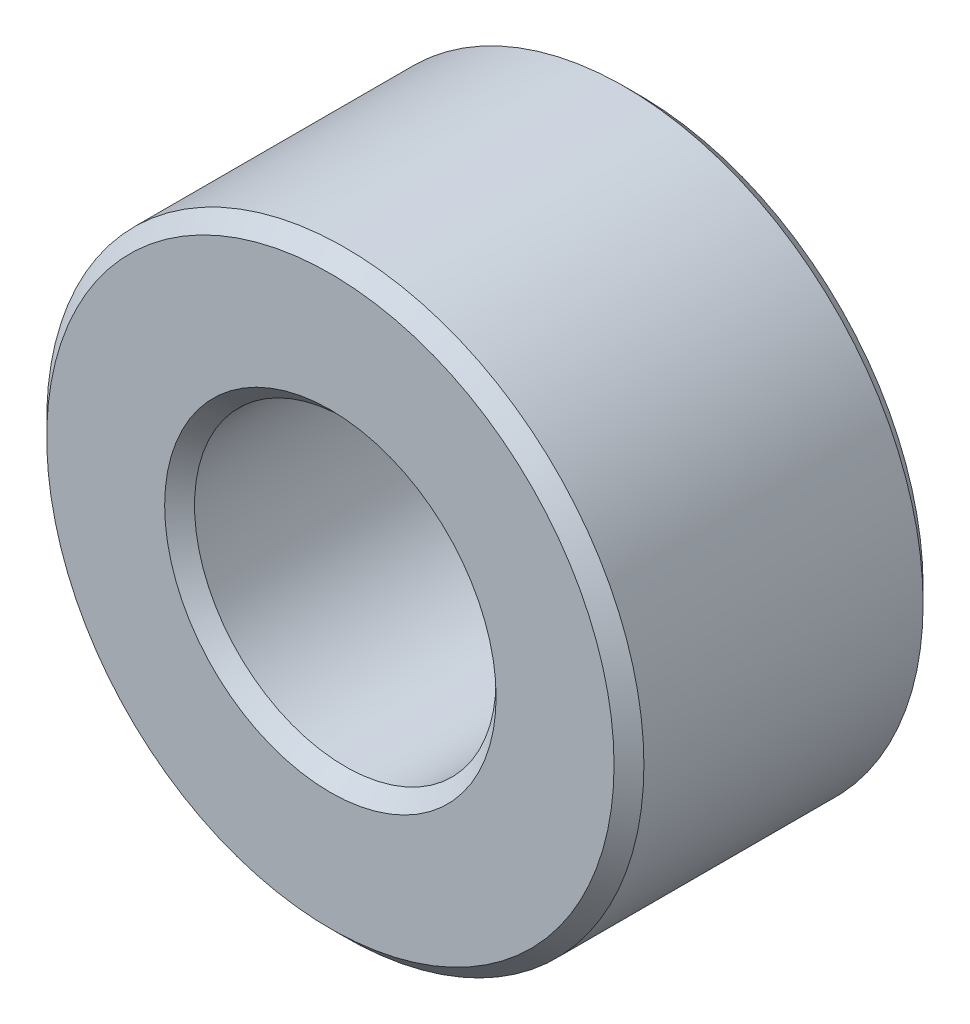
ISO-10303-21;
HEADER;
FILE_DESCRIPTION(('STEP AP214'),'2;1');
FILE_NAME('part.step','',(''),(''),'','','');
FILE_SCHEMA(('AUTOMOTIVE_DESIGN { 1 0 10303 214 1 1 1 1 }'));
ENDSEC;
DATA;
#1=APPLICATION_CONTEXT('core data for automotive mechanical design processes');
#2=APPLICATION_PROTOCOL_DEFINITION('international standard','automotive_design',2000,#1);
#3=PRODUCT_CONTEXT('',#1,'mechanical');
#4=PRODUCT('Part','Part','',(#3));
#5=PRODUCT_RELATED_PRODUCT_CATEGORY('part','',(#4));
#6=PRODUCT_DEFINITION_FORMATION('','',#4);
#7=PRODUCT_DEFINITION_CONTEXT('part definition',#1,'design');
#8=PRODUCT_DEFINITION('design','',#6,#7);
#9=PRODUCT_DEFINITION_SHAPE('','',#8);
#10=(LENGTH_UNIT() NAMED_UNIT(*) SI_UNIT(.MILLI.,.METRE.));
#11=(NAMED_UNIT(*) PLANE_ANGLE_UNIT() SI_UNIT($,.RADIAN.));
#12=(NAMED_UNIT(*) SI_UNIT($,.STERADIAN.) SOLID_ANGLE_UNIT());
#13=UNCERTAINTY_MEASURE_WITH_UNIT(LENGTH_MEASURE(1.E-05),#10,'distance_accuracy_value','');
#14=(GEOMETRIC_REPRESENTATION_CONTEXT(3) GLOBAL_UNCERTAINTY_ASSIGNED_CONTEXT((#13)) GLOBAL_UNIT_ASSIGNED_CONTEXT((#10,
#11,#12)) REPRESENTATION_CONTEXT('',''));
#15=CARTESIAN_POINT('',(0.,0.,0.));
#16=DIRECTION('',(0.,0.,1.));
#17=DIRECTION('',(1.,0.,0.));
#18=AXIS2_PLACEMENT_3D('',#15,#16,#17);
#19=CARTESIAN_POINT('',(0.,0.,5.175));
#20=DIRECTION('',(0.,0.,1.));
#21=DIRECTION('',(1.,0.,0.));
#22=AXIS2_PLACEMENT_3D('',#19,#20,#21);
#23=PLANE('',#22);
#24=CARTESIAN_POINT('',(0.,0.,5.175));
#25=DIRECTION('',(0.,0.,1.));
#26=DIRECTION('',(1.,0.,0.));
#27=AXIS2_PLACEMENT_3D('',#24,#25,#26);
#28=CIRCLE('',#27,5.55000000000001);
#29=CARTESIAN_POINT('',(5.55000000000001,0.,5.175));
#30=VERTEX_POINT('',#29);
#31=EDGE_CURVE('E10',#30,#30,#28,.F.);
#32=ORIENTED_EDGE('',*,*,#31,.T.);
#33=EDGE_LOOP('',(#32));
#34=FACE_BOUND('',#33,.T.);
#35=CARTESIAN_POINT('',(0.,0.,5.175));
#36=DIRECTION('',(0.,0.,1.));
#37=DIRECTION('',(1.,0.,0.));
#38=AXIS2_PLACEMENT_3D('',#35,#36,#37);
#39=CIRCLE('',#38,9.5);
#40=CARTESIAN_POINT('',(9.5,0.,5.175));
#41=VERTEX_POINT('',#40);
#42=EDGE_CURVE('E51',#41,#41,#39,.T.);
#43=ORIENTED_EDGE('',*,*,#42,.T.);
#44=EDGE_LOOP('',(#43));
#45=FACE_BOUND('',#44,.T.);
#46=ADVANCED_FACE('F43',(#34,#45),#23,.T.);
#47=CARTESIAN_POINT('',(0.,0.,-5.175));
#48=DIRECTION('',(0.,0.,1.));
#49=DIRECTION('',(1.,0.,0.));
#50=AXIS2_PLACEMENT_3D('',#47,#48,#49);
#51=PLANE('',#50);
#52=CARTESIAN_POINT('',(0.,0.,-5.175));
#53=DIRECTION('',(0.,0.,1.));
#54=DIRECTION('',(1.,0.,0.));
#55=AXIS2_PLACEMENT_3D('',#52,#53,#54);
#56=CIRCLE('',#55,5.55);
#57=CARTESIAN_POINT('',(5.55,0.,-5.175));
#58=VERTEX_POINT('',#57);
#59=EDGE_CURVE('E66',#58,#58,#56,.T.);
#60=ORIENTED_EDGE('',*,*,#59,.T.);
#61=EDGE_LOOP('',(#60));
#62=FACE_BOUND('',#61,.T.);
#63=CARTESIAN_POINT('',(0.,0.,-5.175));
#64=DIRECTION('',(0.,0.,1.));
#65=DIRECTION('',(1.,0.,0.));
#66=AXIS2_PLACEMENT_3D('',#63,#64,#65);
#67=CIRCLE('',#66,9.5);
#68=CARTESIAN_POINT('',(9.5,0.,-5.175));
#69=VERTEX_POINT('',#68);
#70=EDGE_CURVE('E71',#69,#69,#67,.F.);
#71=ORIENTED_EDGE('',*,*,#70,.T.);
#72=EDGE_LOOP('',(#71));
#73=FACE_BOUND('',#72,.T.);
#74=ADVANCED_FACE('F80',(#62,#73),#51,.F.);
#75=CARTESIAN_POINT('',(0.,0.,5.175));
#76=DIRECTION('',(0.,0.,-1.));
#77=DIRECTION('',(-1.,0.,0.));
#78=AXIS2_PLACEMENT_3D('',#75,#76,#77);
#79=CYLINDRICAL_SURFACE('',#78,10.);
#80=CARTESIAN_POINT('',(0.,0.,-4.675));
#81=DIRECTION('',(0.,0.,1.));
#82=DIRECTION('',(1.,0.,0.));
#83=AXIS2_PLACEMENT_3D('',#80,#81,#82);
#84=CIRCLE('',#83,10.);
#85=CARTESIAN_POINT('',(10.,0.,-4.675));
#86=VERTEX_POINT('',#85);
#87=EDGE_CURVE('E54',#86,#86,#84,.T.);
#88=ORIENTED_EDGE('',*,*,#87,.T.);
#89=EDGE_LOOP('',(#88));
#90=FACE_BOUND('',#89,.T.);
#91=CARTESIAN_POINT('',(0.,0.,4.67499999999999));
#92=DIRECTION('',(0.,0.,1.));
#93=DIRECTION('',(1.,0.,0.));
#94=AXIS2_PLACEMENT_3D('',#91,#92,#93);
#95=CIRCLE('',#94,10.);
#96=CARTESIAN_POINT('',(10.,0.,4.67499999999999));
#97=VERTEX_POINT('',#96);
#98=EDGE_CURVE('E56',#97,#97,#95,.F.);
#99=ORIENTED_EDGE('',*,*,#98,.T.);
#100=EDGE_LOOP('',(#99));
#101=FACE_BOUND('',#100,.T.);
#102=ADVANCED_FACE('F87',(#90,#101),#79,.T.);
#103=CARTESIAN_POINT('',(0.,0.,5.175));
#104=DIRECTION('',(0.,0.,-1.));
#105=DIRECTION('',(-1.,0.,0.));
#106=AXIS2_PLACEMENT_3D('',#103,#104,#105);
#107=CYLINDRICAL_SURFACE('',#106,5.05);
#108=CARTESIAN_POINT('',(0.,0.,-4.675));
#109=DIRECTION('',(0.,0.,1.));
#110=DIRECTION('',(1.,0.,0.));
#111=AXIS2_PLACEMENT_3D('',#108,#109,#110);
#112=CIRCLE('',#111,5.05);
#113=CARTESIAN_POINT('',(5.05,0.,-4.675));
#114=VERTEX_POINT('',#113);
#115=EDGE_CURVE('E62',#114,#114,#112,.F.);
#116=ORIENTED_EDGE('',*,*,#115,.T.);
#117=EDGE_LOOP('',(#116));
#118=FACE_BOUND('',#117,.T.);
#119=CARTESIAN_POINT('',(0.,0.,4.67499999999999));
#120=DIRECTION('',(0.,0.,1.));
#121=DIRECTION('',(1.,0.,0.));
#122=AXIS2_PLACEMENT_3D('',#119,#120,#121);
#123=CIRCLE('',#122,5.05);
#124=CARTESIAN_POINT('',(5.05,0.,4.67499999999999));
#125=VERTEX_POINT('',#124);
#126=EDGE_CURVE('E69',#125,#125,#123,.T.);
#127=ORIENTED_EDGE('',*,*,#126,.T.);
#128=EDGE_LOOP('',(#127));
#129=FACE_BOUND('',#128,.T.);
#130=ADVANCED_FACE('F89',(#118,#129),#107,.F.);
#131=CARTESIAN_POINT('',(0.,0.,-5.175));
#132=DIRECTION('',(0.,0.,-1.));
#133=DIRECTION('',(-1.,0.,0.));
#134=AXIS2_PLACEMENT_3D('',#131,#132,#133);
#135=CONICAL_SURFACE('',#134,5.55,0.785398163397449);
#136=ORIENTED_EDGE('',*,*,#115,.F.);
#137=EDGE_LOOP('',(#136));
#138=FACE_BOUND('',#137,.T.);
#139=ORIENTED_EDGE('',*,*,#59,.F.);
#140=EDGE_LOOP('',(#139));
#141=FACE_BOUND('',#140,.T.);
#142=ADVANCED_FACE('F82',(#138,#141),#135,.F.);
#143=CARTESIAN_POINT('',(0.,0.,-4.675));
#144=DIRECTION('',(0.,0.,1.));
#145=DIRECTION('',(1.,0.,0.));
#146=AXIS2_PLACEMENT_3D('',#143,#144,#145);
#147=CONICAL_SURFACE('',#146,10.,0.78539816339745);
#148=ORIENTED_EDGE('',*,*,#70,.F.);
#149=EDGE_LOOP('',(#148));
#150=FACE_BOUND('',#149,.T.);
#151=ORIENTED_EDGE('',*,*,#87,.F.);
#152=EDGE_LOOP('',(#151));
#153=FACE_BOUND('',#152,.T.);
#154=ADVANCED_FACE('F77',(#150,#153),#147,.T.);
#155=CARTESIAN_POINT('',(0.,0.,4.67499999999999));
#156=DIRECTION('',(0.,0.,1.));
#157=DIRECTION('',(1.,0.,0.));
#158=AXIS2_PLACEMENT_3D('',#155,#156,#157);
#159=CONICAL_SURFACE('',#158,5.05,0.785398163397452);
#160=ORIENTED_EDGE('',*,*,#31,.F.);
#161=EDGE_LOOP('',(#160));
#162=FACE_BOUND('',#161,.T.);
#163=ORIENTED_EDGE('',*,*,#126,.F.);
#164=EDGE_LOOP('',(#163));
#165=FACE_BOUND('',#164,.T.);
#166=ADVANCED_FACE('F84',(#162,#165),#159,.F.);
#167=CARTESIAN_POINT('',(0.,0.,5.175));
#168=DIRECTION('',(0.,0.,-1.));
#169=DIRECTION('',(-1.,0.,0.));
#170=AXIS2_PLACEMENT_3D('',#167,#168,#169);
#171=CONICAL_SURFACE('',#170,9.5,0.785398163397445);
#172=ORIENTED_EDGE('',*,*,#98,.F.);
#173=EDGE_LOOP('',(#172));
#174=FACE_BOUND('',#173,.T.);
#175=ORIENTED_EDGE('',*,*,#42,.F.);
#176=EDGE_LOOP('',(#175));
#177=FACE_BOUND('',#176,.T.);
#178=ADVANCED_FACE('F46',(#174,#177),#171,.T.);
#179=CLOSED_SHELL('',(#46,#74,#102,#130,#142,#154,#166,#178));
#180=MANIFOLD_SOLID_BREP('B2',#179);
#181=ADVANCED_BREP_SHAPE_REPRESENTATION('',(#18,#180),#14);
#182=SHAPE_DEFINITION_REPRESENTATION(#9,#181);
ENDSEC;
END-ISO-10303-21;
